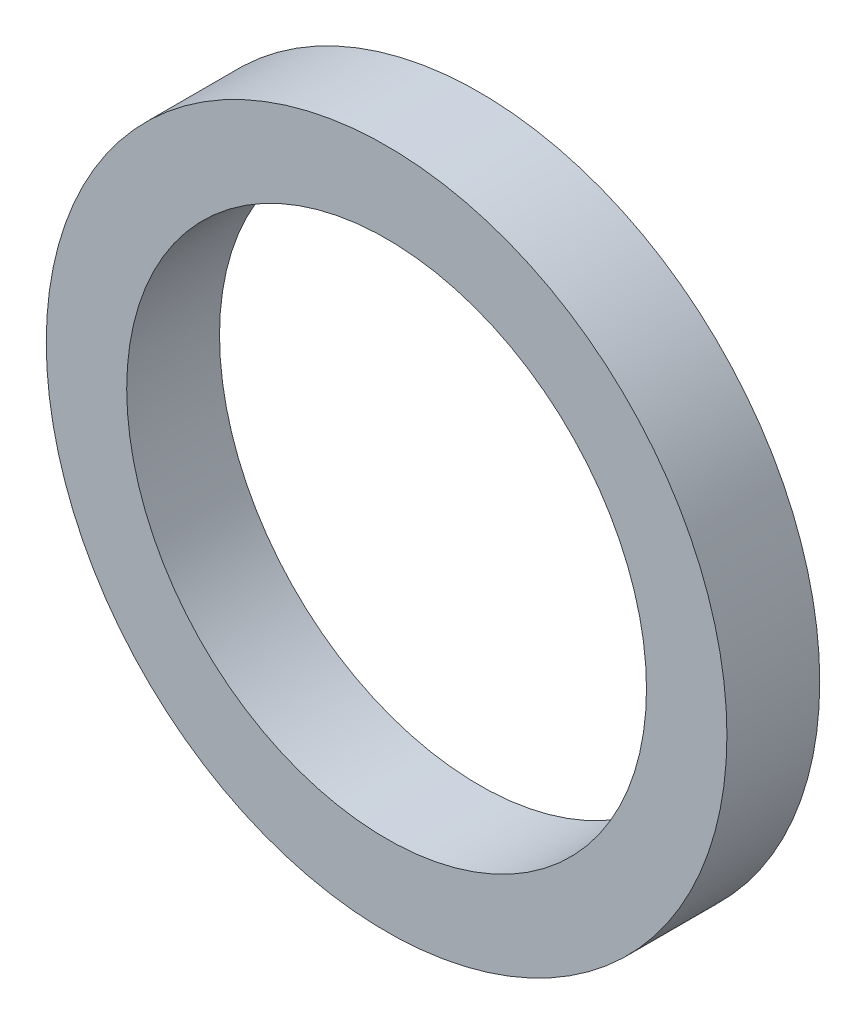
ISO-10303-21;
HEADER;
FILE_DESCRIPTION(('STEP AP214'),'2;1');
FILE_NAME('part.step','',(''),(''),'','','');
FILE_SCHEMA(('AUTOMOTIVE_DESIGN { 1 0 10303 214 1 1 1 1 }'));
ENDSEC;
DATA;
#1=APPLICATION_CONTEXT('core data for automotive mechanical design processes');
#2=APPLICATION_PROTOCOL_DEFINITION('international standard','automotive_design',2000,#1);
#3=PRODUCT_CONTEXT('',#1,'mechanical');
#4=PRODUCT('Part','Part','',(#3));
#5=PRODUCT_RELATED_PRODUCT_CATEGORY('part','',(#4));
#6=PRODUCT_DEFINITION_FORMATION('','',#4);
#7=PRODUCT_DEFINITION_CONTEXT('part definition',#1,'design');
#8=PRODUCT_DEFINITION('design','',#6,#7);
#9=PRODUCT_DEFINITION_SHAPE('','',#8);
#10=(LENGTH_UNIT() NAMED_UNIT(*) SI_UNIT(.MILLI.,.METRE.));
#11=(NAMED_UNIT(*) PLANE_ANGLE_UNIT() SI_UNIT($,.RADIAN.));
#12=(NAMED_UNIT(*) SI_UNIT($,.STERADIAN.) SOLID_ANGLE_UNIT());
#13=UNCERTAINTY_MEASURE_WITH_UNIT(LENGTH_MEASURE(1.E-05),#10,'distance_accuracy_value','');
#14=(GEOMETRIC_REPRESENTATION_CONTEXT(3) GLOBAL_UNCERTAINTY_ASSIGNED_CONTEXT((#13)) GLOBAL_UNIT_ASSIGNED_CONTEXT((#10,
#11,#12)) REPRESENTATION_CONTEXT('',''));
#15=CARTESIAN_POINT('',(0.,0.,0.));
#16=DIRECTION('',(0.,0.,1.));
#17=DIRECTION('',(1.,0.,0.));
#18=AXIS2_PLACEMENT_3D('',#15,#16,#17);
#19=CARTESIAN_POINT('',(0.,0.,12.));
#20=DIRECTION('',(0.,0.,-1.));
#21=DIRECTION('',(-1.,0.,0.));
#22=AXIS2_PLACEMENT_3D('',#19,#20,#21);
#23=CYLINDRICAL_SURFACE('',#22,5.5);
#24=CARTESIAN_POINT('',(0.,0.,12.));
#25=DIRECTION('',(0.,0.,1.));
#26=DIRECTION('',(1.,0.,0.));
#27=AXIS2_PLACEMENT_3D('',#24,#25,#26);
#28=CIRCLE('',#27,5.5);
#29=CARTESIAN_POINT('',(5.5,0.,12.));
#30=VERTEX_POINT('',#29);
#31=EDGE_CURVE('E10',#30,#30,#28,.T.);
#32=ORIENTED_EDGE('',*,*,#31,.F.);
#33=EDGE_LOOP('',(#32));
#34=FACE_BOUND('',#33,.T.);
#35=CARTESIAN_POINT('',(0.,0.,10.5));
#36=DIRECTION('',(0.,0.,1.));
#37=DIRECTION('',(1.,0.,0.));
#38=AXIS2_PLACEMENT_3D('',#35,#36,#37);
#39=CIRCLE('',#38,5.5);
#40=CARTESIAN_POINT('',(5.5,0.,10.5));
#41=VERTEX_POINT('',#40);
#42=EDGE_CURVE('E42',#41,#41,#39,.T.);
#43=ORIENTED_EDGE('',*,*,#42,.T.);
#44=EDGE_LOOP('',(#43));
#45=FACE_BOUND('',#44,.T.);
#46=ADVANCED_FACE('F40',(#34,#45),#23,.T.);
#47=CARTESIAN_POINT('',(0.,0.,12.));
#48=DIRECTION('',(0.,0.,1.));
#49=DIRECTION('',(1.,0.,0.));
#50=AXIS2_PLACEMENT_3D('',#47,#48,#49);
#51=PLANE('',#50);
#52=CARTESIAN_POINT('',(0.,0.,12.));
#53=DIRECTION('',(0.,0.,1.));
#54=DIRECTION('',(1.,0.,0.));
#55=AXIS2_PLACEMENT_3D('',#52,#53,#54);
#56=CIRCLE('',#55,4.2);
#57=CARTESIAN_POINT('',(-4.2,0.,12.));
#58=VERTEX_POINT('',#57);
#59=EDGE_CURVE('E49',#58,#58,#56,.T.);
#60=ORIENTED_EDGE('',*,*,#59,.F.);
#61=EDGE_LOOP('',(#60));
#62=FACE_BOUND('',#61,.T.);
#63=ORIENTED_EDGE('',*,*,#31,.T.);
#64=EDGE_LOOP('',(#63));
#65=FACE_BOUND('',#64,.T.);
#66=ADVANCED_FACE('F64',(#62,#65),#51,.T.);
#67=CARTESIAN_POINT('',(0.,0.,10.5));
#68=DIRECTION('',(0.,0.,1.));
#69=DIRECTION('',(1.,0.,0.));
#70=AXIS2_PLACEMENT_3D('',#67,#68,#69);
#71=PLANE('',#70);
#72=CARTESIAN_POINT('',(0.,0.,10.5));
#73=DIRECTION('',(0.,0.,1.));
#74=DIRECTION('',(1.,0.,0.));
#75=AXIS2_PLACEMENT_3D('',#72,#73,#74);
#76=CIRCLE('',#75,4.2);
#77=CARTESIAN_POINT('',(-4.2,0.,10.5));
#78=VERTEX_POINT('',#77);
#79=EDGE_CURVE('E37',#78,#78,#76,.F.);
#80=ORIENTED_EDGE('',*,*,#79,.F.);
#81=EDGE_LOOP('',(#80));
#82=FACE_BOUND('',#81,.T.);
#83=ORIENTED_EDGE('',*,*,#42,.F.);
#84=EDGE_LOOP('',(#83));
#85=FACE_BOUND('',#84,.T.);
#86=ADVANCED_FACE('F56',(#82,#85),#71,.F.);
#87=CARTESIAN_POINT('',(0.,0.,10.5));
#88=DIRECTION('',(0.,0.,-1.));
#89=DIRECTION('',(-1.,0.,0.));
#90=AXIS2_PLACEMENT_3D('',#87,#88,#89);
#91=CYLINDRICAL_SURFACE('',#90,4.2);
#92=CARTESIAN_POINT('',(-4.2,0.,12.));
#93=CARTESIAN_POINT('',(-4.2,0.,11.984375));
#94=CARTESIAN_POINT('',(-4.2,0.,11.96875));
#95=CARTESIAN_POINT('',(-4.2,0.,11.9375));
#96=CARTESIAN_POINT('',(-4.2,0.,11.921875));
#97=CARTESIAN_POINT('',(-4.2,0.,11.890625));
#98=CARTESIAN_POINT('',(-4.2,0.,11.875));
#99=CARTESIAN_POINT('',(-4.2,0.,11.84375));
#100=CARTESIAN_POINT('',(-4.2,0.,11.828125));
#101=CARTESIAN_POINT('',(-4.2,0.,11.796875));
#102=CARTESIAN_POINT('',(-4.2,0.,11.78125));
#103=CARTESIAN_POINT('',(-4.2,0.,11.75));
#104=CARTESIAN_POINT('',(-4.2,0.,11.734375));
#105=CARTESIAN_POINT('',(-4.2,0.,11.703125));
#106=CARTESIAN_POINT('',(-4.2,0.,11.6875));
#107=CARTESIAN_POINT('',(-4.2,0.,11.65625));
#108=CARTESIAN_POINT('',(-4.2,0.,11.640625));
#109=CARTESIAN_POINT('',(-4.2,0.,11.609375));
#110=CARTESIAN_POINT('',(-4.2,0.,11.59375));
#111=CARTESIAN_POINT('',(-4.2,0.,11.5625));
#112=CARTESIAN_POINT('',(-4.2,0.,11.546875));
#113=CARTESIAN_POINT('',(-4.2,0.,11.515625));
#114=CARTESIAN_POINT('',(-4.2,0.,11.5));
#115=CARTESIAN_POINT('',(-4.2,0.,11.46875));
#116=CARTESIAN_POINT('',(-4.2,0.,11.453125));
#117=CARTESIAN_POINT('',(-4.2,0.,11.421875));
#118=CARTESIAN_POINT('',(-4.2,0.,11.40625));
#119=CARTESIAN_POINT('',(-4.2,0.,11.375));
#120=CARTESIAN_POINT('',(-4.2,0.,11.359375));
#121=CARTESIAN_POINT('',(-4.2,0.,11.328125));
#122=CARTESIAN_POINT('',(-4.2,0.,11.3125));
#123=CARTESIAN_POINT('',(-4.2,0.,11.28125));
#124=CARTESIAN_POINT('',(-4.2,0.,11.265625));
#125=CARTESIAN_POINT('',(-4.2,0.,11.234375));
#126=CARTESIAN_POINT('',(-4.2,0.,11.21875));
#127=CARTESIAN_POINT('',(-4.2,0.,11.1875));
#128=CARTESIAN_POINT('',(-4.2,0.,11.171875));
#129=CARTESIAN_POINT('',(-4.2,0.,11.140625));
#130=CARTESIAN_POINT('',(-4.2,0.,11.125));
#131=CARTESIAN_POINT('',(-4.2,0.,11.09375));
#132=CARTESIAN_POINT('',(-4.2,0.,11.078125));
#133=CARTESIAN_POINT('',(-4.2,0.,11.046875));
#134=CARTESIAN_POINT('',(-4.2,0.,11.03125));
#135=CARTESIAN_POINT('',(-4.2,0.,11.));
#136=CARTESIAN_POINT('',(-4.2,0.,10.984375));
#137=CARTESIAN_POINT('',(-4.2,0.,10.953125));
#138=CARTESIAN_POINT('',(-4.2,0.,10.9375));
#139=CARTESIAN_POINT('',(-4.2,0.,10.90625));
#140=CARTESIAN_POINT('',(-4.2,0.,10.890625));
#141=CARTESIAN_POINT('',(-4.2,0.,10.859375));
#142=CARTESIAN_POINT('',(-4.2,0.,10.84375));
#143=CARTESIAN_POINT('',(-4.2,0.,10.8125));
#144=CARTESIAN_POINT('',(-4.2,0.,10.796875));
#145=CARTESIAN_POINT('',(-4.2,0.,10.765625));
#146=CARTESIAN_POINT('',(-4.2,0.,10.75));
#147=CARTESIAN_POINT('',(-4.2,0.,10.71875));
#148=CARTESIAN_POINT('',(-4.2,0.,10.703125));
#149=CARTESIAN_POINT('',(-4.2,0.,10.671875));
#150=CARTESIAN_POINT('',(-4.2,0.,10.65625));
#151=CARTESIAN_POINT('',(-4.2,0.,10.625));
#152=CARTESIAN_POINT('',(-4.2,0.,10.609375));
#153=CARTESIAN_POINT('',(-4.2,0.,10.578125));
#154=CARTESIAN_POINT('',(-4.2,0.,10.5625));
#155=CARTESIAN_POINT('',(-4.2,0.,10.53125));
#156=CARTESIAN_POINT('',(-4.2,0.,10.515625));
#157=CARTESIAN_POINT('',(-4.2,0.,10.5));
#158=B_SPLINE_CURVE_WITH_KNOTS('',3,(#92,#93,#94,#95,#96,#97,#98,#99,#100,#101,#102,#103,#104,
#105,#106,#107,#108,#109,#110,#111,#112,#113,#114,#115,#116,#117,#118,#119,#120,#121,#122,#123,
#124,#125,#126,#127,#128,#129,#130,#131,#132,#133,#134,#135,#136,#137,#138,#139,#140,#141,#142,
#143,#144,#145,#146,#147,#148,#149,#150,#151,#152,#153,#154,#155,#156,#157),.UNSPECIFIED.,.F.,
.F.,(4,2,2,2,2,2,2,2,2,2,2,2,2,2,2,2,2,2,2,2,2,2,2,2,2,2,2,2,2,2,2,2,4),(0.,0.046875,
0.0937500000000001,0.140625,0.187499999999998,0.234375,0.281249999999999,0.328124999999999,
0.374999999999999,0.421874999999999,0.468749999999999,0.515624999999999,0.562499999999999,
0.609374999999999,0.656249999999999,0.703124999999999,0.749999999999999,0.796874999999999,
0.843749999999999,0.890624999999999,0.937499999999999,0.984374999999999,1.03125,1.078125,1.125,
1.171875,1.21875,1.265625,1.3125,1.359375,1.40625,1.453125,1.5),.UNSPECIFIED.);
#159=EDGE_CURVE('BSEAM60',#58,#78,#158,.T.);
#160=ORIENTED_EDGE('',*,*,#59,.T.);
#161=ORIENTED_EDGE('',*,*,#79,.T.);
#162=ORIENTED_EDGE('',*,*,#159,.T.);
#163=ORIENTED_EDGE('',*,*,#159,.F.);
#164=EDGE_LOOP('',(#160,#162,#161,#163));
#165=FACE_BOUND('',#164,.T.);
#166=ADVANCED_FACE('F60',(#165),#91,.F.);
#167=CLOSED_SHELL('',(#46,#66,#86,#166));
#168=MANIFOLD_SOLID_BREP('B2',#167);
#169=ADVANCED_BREP_SHAPE_REPRESENTATION('',(#18,#168),#14);
#170=SHAPE_DEFINITION_REPRESENTATION(#9,#169);
ENDSEC;
END-ISO-10303-21;
